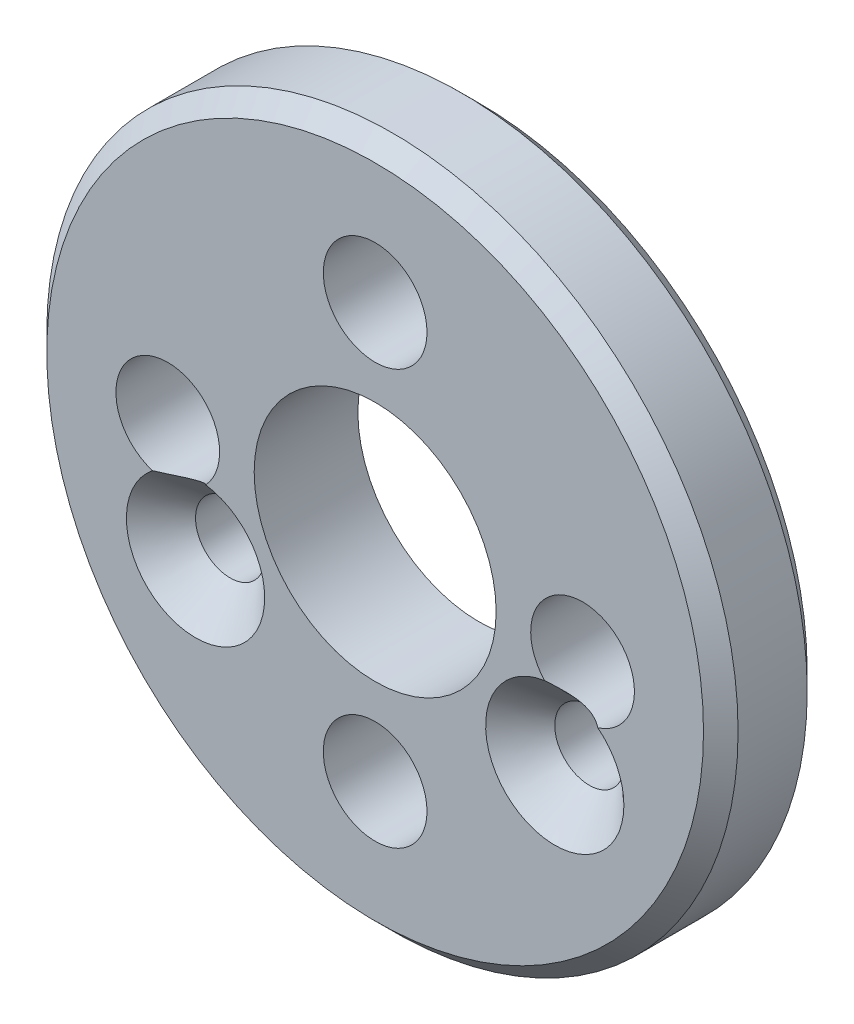
ISO-10303-21;
HEADER;
FILE_DESCRIPTION(('STEP AP214'),'2;1');
FILE_NAME('part.step','',(''),(''),'','','');
FILE_SCHEMA(('AUTOMOTIVE_DESIGN { 1 0 10303 214 1 1 1 1 }'));
ENDSEC;
DATA;
#1=APPLICATION_CONTEXT('core data for automotive mechanical design processes');
#2=APPLICATION_PROTOCOL_DEFINITION('international standard','automotive_design',2000,#1);
#3=PRODUCT_CONTEXT('',#1,'mechanical');
#4=PRODUCT('Part','Part','',(#3));
#5=PRODUCT_RELATED_PRODUCT_CATEGORY('part','',(#4));
#6=PRODUCT_DEFINITION_FORMATION('','',#4);
#7=PRODUCT_DEFINITION_CONTEXT('part definition',#1,'design');
#8=PRODUCT_DEFINITION('design','',#6,#7);
#9=PRODUCT_DEFINITION_SHAPE('','',#8);
#10=(LENGTH_UNIT() NAMED_UNIT(*) SI_UNIT(.MILLI.,.METRE.));
#11=(NAMED_UNIT(*) PLANE_ANGLE_UNIT() SI_UNIT($,.RADIAN.));
#12=(NAMED_UNIT(*) SI_UNIT($,.STERADIAN.) SOLID_ANGLE_UNIT());
#13=UNCERTAINTY_MEASURE_WITH_UNIT(LENGTH_MEASURE(1.E-05),#10,'distance_accuracy_value','');
#14=(GEOMETRIC_REPRESENTATION_CONTEXT(3) GLOBAL_UNCERTAINTY_ASSIGNED_CONTEXT((#13)) GLOBAL_UNIT_ASSIGNED_CONTEXT((#10,
#11,#12)) REPRESENTATION_CONTEXT('',''));
#15=CARTESIAN_POINT('',(0.,0.,0.));
#16=DIRECTION('',(0.,0.,1.));
#17=DIRECTION('',(1.,0.,0.));
#18=AXIS2_PLACEMENT_3D('',#15,#16,#17);
#19=CARTESIAN_POINT('',(-5.1961524227065,-3.00000000000022,3.));
#20=DIRECTION('',(0.,0.,-1.));
#21=DIRECTION('',(-1.,0.,0.));
#22=AXIS2_PLACEMENT_3D('',#19,#20,#21);
#23=CYLINDRICAL_SURFACE('',#22,1.00000000000048);
#24=CARTESIAN_POINT('',(-5.1961524227065,-3.00000000000022,2.));
#25=DIRECTION('',(0.,0.,1.));
#26=DIRECTION('',(1.,0.,0.));
#27=AXIS2_PLACEMENT_3D('',#24,#25,#26);
#28=CIRCLE('',#27,1.00000000000048);
#29=CARTESIAN_POINT('',(-4.19615242270602,-3.00000000000022,2.));
#30=VERTEX_POINT('',#29);
#31=EDGE_CURVE('E58',#30,#30,#28,.T.);
#32=ORIENTED_EDGE('',*,*,#31,.T.);
#33=EDGE_LOOP('',(#32));
#34=FACE_BOUND('',#33,.T.);
#35=CARTESIAN_POINT('',(-5.1961524227065,-3.00000000000022,0.));
#36=DIRECTION('',(0.,0.,1.));
#37=DIRECTION('',(1.,0.,0.));
#38=AXIS2_PLACEMENT_3D('',#35,#36,#37);
#39=CIRCLE('',#38,1.00000000000048);
#40=CARTESIAN_POINT('',(-4.19615242270602,-3.00000000000022,0.));
#41=VERTEX_POINT('',#40);
#42=EDGE_CURVE('E94',#41,#41,#39,.T.);
#43=ORIENTED_EDGE('',*,*,#42,.F.);
#44=EDGE_LOOP('',(#43));
#45=FACE_BOUND('',#44,.T.);
#46=ADVANCED_FACE('F42',(#34,#45),#23,.F.);
#47=CARTESIAN_POINT('',(5.19615242270676,-2.99999999999978,3.));
#48=DIRECTION('',(0.,0.,-1.));
#49=DIRECTION('',(-1.,0.,0.));
#50=AXIS2_PLACEMENT_3D('',#47,#48,#49);
#51=CYLINDRICAL_SURFACE('',#50,1.00000000000033);
#52=CARTESIAN_POINT('',(5.19615242270676,-2.99999999999978,1.99999999999999));
#53=DIRECTION('',(0.,0.,1.));
#54=DIRECTION('',(1.,0.,0.));
#55=AXIS2_PLACEMENT_3D('',#52,#53,#54);
#56=CIRCLE('',#55,1.00000000000033);
#57=CARTESIAN_POINT('',(6.19615242270709,-2.99999999999978,1.99999999999999));
#58=VERTEX_POINT('',#57);
#59=EDGE_CURVE('E88',#58,#58,#56,.T.);
#60=ORIENTED_EDGE('',*,*,#59,.T.);
#61=EDGE_LOOP('',(#60));
#62=FACE_BOUND('',#61,.T.);
#63=CARTESIAN_POINT('',(5.19615242270676,-2.99999999999978,0.));
#64=DIRECTION('',(0.,0.,1.));
#65=DIRECTION('',(1.,0.,0.));
#66=AXIS2_PLACEMENT_3D('',#63,#64,#65);
#67=CIRCLE('',#66,1.00000000000033);
#68=CARTESIAN_POINT('',(6.19615242270709,-2.99999999999978,0.));
#69=VERTEX_POINT('',#68);
#70=EDGE_CURVE('E102',#69,#69,#67,.T.);
#71=ORIENTED_EDGE('',*,*,#70,.F.);
#72=EDGE_LOOP('',(#71));
#73=FACE_BOUND('',#72,.T.);
#74=ADVANCED_FACE('F204',(#62,#73),#51,.F.);
#75=CARTESIAN_POINT('',(0.,6.,3.));
#76=DIRECTION('',(0.,0.,-1.));
#77=DIRECTION('',(-1.,0.,0.));
#78=AXIS2_PLACEMENT_3D('',#75,#76,#77);
#79=CYLINDRICAL_SURFACE('',#78,1.5);
#80=CARTESIAN_POINT('',(0.,6.,3.));
#81=DIRECTION('',(0.,0.,1.));
#82=DIRECTION('',(1.,0.,0.));
#83=AXIS2_PLACEMENT_3D('',#80,#81,#82);
#84=CIRCLE('',#83,1.5);
#85=CARTESIAN_POINT('',(1.5,6.,3.));
#86=VERTEX_POINT('',#85);
#87=EDGE_CURVE('E111',#86,#86,#84,.T.);
#88=ORIENTED_EDGE('',*,*,#87,.T.);
#89=EDGE_LOOP('',(#88));
#90=FACE_BOUND('',#89,.T.);
#91=CARTESIAN_POINT('',(0.,6.,0.));
#92=DIRECTION('',(0.,0.,1.));
#93=DIRECTION('',(1.,0.,0.));
#94=AXIS2_PLACEMENT_3D('',#91,#92,#93);
#95=CIRCLE('',#94,1.5);
#96=CARTESIAN_POINT('',(1.5,6.,0.));
#97=VERTEX_POINT('',#96);
#98=EDGE_CURVE('E132',#97,#97,#95,.T.);
#99=ORIENTED_EDGE('',*,*,#98,.F.);
#100=EDGE_LOOP('',(#99));
#101=FACE_BOUND('',#100,.T.);
#102=ADVANCED_FACE('F211',(#90,#101),#79,.F.);
#103=CARTESIAN_POINT('',(0.,0.,3.));
#104=DIRECTION('',(0.,0.,-1.));
#105=DIRECTION('',(-1.,0.,0.));
#106=AXIS2_PLACEMENT_3D('',#103,#104,#105);
#107=CYLINDRICAL_SURFACE('',#106,3.5);
#108=CARTESIAN_POINT('',(0.,0.,3.));
#109=DIRECTION('',(0.,0.,1.));
#110=DIRECTION('',(1.,0.,0.));
#111=AXIS2_PLACEMENT_3D('',#108,#109,#110);
#112=CIRCLE('',#111,3.5);
#113=CARTESIAN_POINT('',(3.5,0.,3.));
#114=VERTEX_POINT('',#113);
#115=EDGE_CURVE('E107',#114,#114,#112,.T.);
#116=ORIENTED_EDGE('',*,*,#115,.T.);
#117=EDGE_LOOP('',(#116));
#118=FACE_BOUND('',#117,.T.);
#119=CARTESIAN_POINT('',(0.,0.,0.));
#120=DIRECTION('',(0.,0.,1.));
#121=DIRECTION('',(1.,0.,0.));
#122=AXIS2_PLACEMENT_3D('',#119,#120,#121);
#123=CIRCLE('',#122,3.5);
#124=CARTESIAN_POINT('',(3.5,0.,0.));
#125=VERTEX_POINT('',#124);
#126=EDGE_CURVE('E128',#125,#125,#123,.T.);
#127=ORIENTED_EDGE('',*,*,#126,.F.);
#128=EDGE_LOOP('',(#127));
#129=FACE_BOUND('',#128,.T.);
#130=ADVANCED_FACE('F201',(#118,#129),#107,.F.);
#131=CARTESIAN_POINT('',(6.,0.,3.));
#132=DIRECTION('',(0.,0.,-1.));
#133=DIRECTION('',(-1.,0.,0.));
#134=AXIS2_PLACEMENT_3D('',#131,#132,#133);
#135=CYLINDRICAL_SURFACE('',#134,1.5);
#136=CARTESIAN_POINT('',(6.,0.,3.));
#137=DIRECTION('',(0.,0.,1.));
#138=DIRECTION('',(1.,0.,0.));
#139=AXIS2_PLACEMENT_3D('',#136,#137,#138);
#140=CIRCLE('',#139,1.5);
#141=CARTESIAN_POINT('',(6.44015518955278,-1.43396771550472,3.));
#142=VERTEX_POINT('',#141);
#143=CARTESIAN_POINT('',(4.90183056648743,-1.02177487505748,3.));
#144=VERTEX_POINT('',#143);
#145=EDGE_CURVE('E99',#142,#144,#140,.T.);
#146=ORIENTED_EDGE('',*,*,#145,.T.);
#147=CARTESIAN_POINT('',(4.90183056648743,-1.02177487505748,3.));
#148=CARTESIAN_POINT('',(4.92303302315713,-1.04455010634076,2.97436761381311));
#149=CARTESIAN_POINT('',(4.94519274903347,-1.06695677851051,2.94916265504846));
#150=CARTESIAN_POINT('',(4.99169474628061,-1.11101632940224,2.89990143946854));
#151=CARTESIAN_POINT('',(5.01604475565149,-1.13266612784486,2.87584975539361));
#152=CARTESIAN_POINT('',(5.06756966313104,-1.17546443690684,2.82890254432455));
#153=CARTESIAN_POINT('',(5.09479260085054,-1.19659329556961,2.80604125349631));
#154=CARTESIAN_POINT('',(5.15181461390856,-1.23766506118033,2.76267577910277));
#155=CARTESIAN_POINT('',(5.18160958326442,-1.25760977561294,2.74216795608576));
#156=CARTESIAN_POINT('',(5.24732745051386,-1.29812416275665,2.70229131852149));
#157=CARTESIAN_POINT('',(5.28356519774468,-1.31853730159963,2.68327165448615));
#158=CARTESIAN_POINT('',(5.35936861498474,-1.35697600552206,2.65064894130602));
#159=CARTESIAN_POINT('',(5.39891524719251,-1.3750138742689,2.63701718258703));
#160=CARTESIAN_POINT('',(5.48160909505413,-1.4082889179449,2.61651922916684));
#161=CARTESIAN_POINT('',(5.52479921930215,-1.42348301347582,2.60975114662465));
#162=CARTESIAN_POINT('',(5.61288371735046,-1.44991380689649,2.60447285500694));
#163=CARTESIAN_POINT('',(5.65777766724778,-1.46115148206517,2.6059606051268));
#164=CARTESIAN_POINT('',(5.74122031871436,-1.47803776645549,2.61614415623826));
#165=CARTESIAN_POINT('',(5.779791059305,-1.48424309741212,2.62381862404778));
#166=CARTESIAN_POINT('',(5.85596575959592,-1.49356262311997,2.6441824575592));
#167=CARTESIAN_POINT('',(5.89356870202823,-1.49667368511689,2.65687688752916));
#168=CARTESIAN_POINT('',(5.99028855399017,-1.50116608714846,2.69532202107824));
#169=CARTESIAN_POINT('',(6.04821885701077,-1.50026341998393,2.72428024948017));
#170=CARTESIAN_POINT('',(6.15998827339364,-1.49250284567381,2.78868939821998));
#171=CARTESIAN_POINT('',(6.21381054041502,-1.4856217142774,2.82416521281803));
#172=CARTESIAN_POINT('',(6.29615553892666,-1.47079752560843,2.88361392274339));
#173=CARTESIAN_POINT('',(6.32594507991869,-1.46446727544544,2.90628506665992));
#174=CARTESIAN_POINT('',(6.38405411901989,-1.45030565663829,2.95251436417402));
#175=CARTESIAN_POINT('',(6.4123836143051,-1.44248693447057,2.9760637891204));
#176=CARTESIAN_POINT('',(6.44015518955278,-1.43396771550472,3.));
#177=B_SPLINE_CURVE_WITH_KNOTS('',3,(#147,#148,#149,#150,#151,#152,#153,#154,#155,#156,#157,
#158,#159,#160,#161,#162,#163,#164,#165,#166,#167,#168,#169,#170,#171,#172,#173,#174,#175,#176),
.UNSPECIFIED.,.F.,.F.,(4,2,2,2,2,2,2,2,2,2,2,2,2,2,4),(0.,0.120963514809028,0.242372554440347,
0.366294637531073,0.490022426258154,0.626819965138981,0.762878417532659,0.900855438277749,
1.03879835324465,1.15773611838754,1.27679417839394,1.47000198331899,1.66396370614888,
1.77780417133892,1.89071741224536),.UNSPECIFIED.);
#178=EDGE_CURVE('E64',#144,#142,#177,.T.);
#179=ORIENTED_EDGE('',*,*,#178,.T.);
#180=EDGE_LOOP('',(#146,#179));
#181=FACE_BOUND('',#180,.T.);
#182=CARTESIAN_POINT('',(6.,0.,0.));
#183=DIRECTION('',(0.,0.,1.));
#184=DIRECTION('',(1.,0.,0.));
#185=AXIS2_PLACEMENT_3D('',#182,#183,#184);
#186=CIRCLE('',#185,1.5);
#187=CARTESIAN_POINT('',(7.5,0.,0.));
#188=VERTEX_POINT('',#187);
#189=EDGE_CURVE('E124',#188,#188,#186,.T.);
#190=ORIENTED_EDGE('',*,*,#189,.F.);
#191=EDGE_LOOP('',(#190));
#192=FACE_BOUND('',#191,.T.);
#193=ADVANCED_FACE('F165',(#181,#192),#135,.F.);
#194=CARTESIAN_POINT('',(0.,-6.,3.));
#195=DIRECTION('',(0.,0.,-1.));
#196=DIRECTION('',(-1.,0.,0.));
#197=AXIS2_PLACEMENT_3D('',#194,#195,#196);
#198=CYLINDRICAL_SURFACE('',#197,1.5);
#199=CARTESIAN_POINT('',(0.,-6.,3.));
#200=DIRECTION('',(0.,0.,1.));
#201=DIRECTION('',(1.,0.,0.));
#202=AXIS2_PLACEMENT_3D('',#199,#200,#201);
#203=CIRCLE('',#202,1.5);
#204=CARTESIAN_POINT('',(1.49999999999996,-6.,3.));
#205=VERTEX_POINT('',#204);
#206=EDGE_CURVE('E93',#205,#205,#203,.T.);
#207=ORIENTED_EDGE('',*,*,#206,.T.);
#208=EDGE_LOOP('',(#207));
#209=FACE_BOUND('',#208,.T.);
#210=CARTESIAN_POINT('',(0.,-6.,0.));
#211=DIRECTION('',(0.,0.,1.));
#212=DIRECTION('',(1.,0.,0.));
#213=AXIS2_PLACEMENT_3D('',#210,#211,#212);
#214=CIRCLE('',#213,1.5);
#215=CARTESIAN_POINT('',(1.49999999999996,-6.,0.));
#216=VERTEX_POINT('',#215);
#217=EDGE_CURVE('E120',#216,#216,#214,.T.);
#218=ORIENTED_EDGE('',*,*,#217,.F.);
#219=EDGE_LOOP('',(#218));
#220=FACE_BOUND('',#219,.T.);
#221=ADVANCED_FACE('F193',(#209,#220),#198,.F.);
#222=CARTESIAN_POINT('',(-6.,0.,3.));
#223=DIRECTION('',(0.,0.,-1.));
#224=DIRECTION('',(-1.,0.,0.));
#225=AXIS2_PLACEMENT_3D('',#222,#223,#224);
#226=CYLINDRICAL_SURFACE('',#225,1.5);
#227=CARTESIAN_POINT('',(-6.,0.,3.));
#228=DIRECTION('',(0.,0.,1.));
#229=DIRECTION('',(1.,0.,0.));
#230=AXIS2_PLACEMENT_3D('',#227,#228,#229);
#231=CIRCLE('',#230,1.5);
#232=CARTESIAN_POINT('',(-4.90183056648771,-1.0217748750577,3.));
#233=VERTEX_POINT('',#232);
#234=CARTESIAN_POINT('',(-6.44015518955228,-1.43396771550479,3.));
#235=VERTEX_POINT('',#234);
#236=EDGE_CURVE('E85',#233,#235,#231,.T.);
#237=ORIENTED_EDGE('',*,*,#236,.T.);
#238=CARTESIAN_POINT('',(-6.44015518955228,-1.43396771550479,3.));
#239=CARTESIAN_POINT('',(-6.41040570781207,-1.44309041603831,2.97436761381314));
#240=CARTESIAN_POINT('',(-6.38001148617741,-1.45141530041339,2.94916265504852));
#241=CARTESIAN_POINT('',(-6.31770979978885,-1.46632099214137,2.89990143946866));
#242=CARTESIAN_POINT('',(-6.28579717386999,-1.47289526289404,2.87584975539376));
#243=CARTESIAN_POINT('',(-6.21977614053412,-1.48419723204093,2.82890254432476));
#244=CARTESIAN_POINT('',(-6.18563595557204,-1.4888838915361,2.80604125349655));
#245=CARTESIAN_POINT('',(-6.11571756088357,-1.49594207740424,2.76267577910306));
#246=CARTESIAN_POINT('',(-6.07994200330014,-1.49831722209617,2.74216795608608));
#247=CARTESIAN_POINT('',(-6.00277146720775,-1.50054477695665,2.70229131852184));
#248=CARTESIAN_POINT('',(-5.96118208810846,-1.50010420015024,2.6832716544865));
#249=CARTESIAN_POINT('',(-5.87631505112365,-1.49549138561558,2.65064894130638));
#250=CARTESIAN_POINT('',(-5.83304772862418,-1.49133932207657,2.6370171825874));
#251=CARTESIAN_POINT('',(-5.74479523380132,-1.47880943128121,2.61651922916723));
#252=CARTESIAN_POINT('',(-5.69979444124446,-1.47037284187449,2.60975114662505));
#253=CARTESIAN_POINT('',(-5.61029563154468,-1.44922033139481,2.60447285500737));
#254=CARTESIAN_POINT('',(-5.56579749287303,-1.4365054686217,2.60596060512724));
#255=CARTESIAN_POINT('',(-5.48509089474868,-1.40940809414593,2.61614415623872));
#256=CARTESIAN_POINT('',(-5.44858498807609,-1.39549669809794,2.62381862404825));
#257=CARTESIAN_POINT('',(-5.37795599964457,-1.36548029396669,2.64418245755969));
#258=CARTESIAN_POINT('',(-5.34383536524268,-1.34937308147262,2.65687688752965));
#259=CARTESIAN_POINT('',(-5.25782731537759,-1.30490368977497,2.69532202107876));
#260=CARTESIAN_POINT('',(-5.20810953489507,-1.27515680556901,2.7242802494807));
#261=CARTESIAN_POINT('',(-5.11519466809638,-1.21255124287702,2.78868939822055));
#262=CARTESIAN_POINT('',(-5.07202378326479,-1.17968087477025,2.82416521281863));
#263=CARTESIAN_POINT('',(-5.00812301701371,-1.12567025153667,2.88361392274391));
#264=CARTESIAN_POINT('',(-4.98548964282913,-1.10529332358728,2.90628506666034));
#265=CARTESIAN_POINT('',(-4.94224654818175,-1.06397448239116,2.95251436417424));
#266=CARTESIAN_POINT('',(-4.9216218466723,-1.04303852272627,2.97606378912051));
#267=CARTESIAN_POINT('',(-4.90183056648771,-1.0217748750577,3.));
#268=B_SPLINE_CURVE_WITH_KNOTS('',3,(#238,#239,#240,#241,#242,#243,#244,#245,#246,#247,#248,
#249,#250,#251,#252,#253,#254,#255,#256,#257,#258,#259,#260,#261,#262,#263,#264,#265,#266,#267),
.UNSPECIFIED.,.F.,.F.,(4,2,2,2,2,2,2,2,2,2,2,2,2,2,4),(0.,0.120963514808911,0.242372554440114,
0.366294637530719,0.490022426257677,0.626819965138522,0.762878417532214,0.90085543827732,
1.03879835324424,1.15773611838714,1.27679417839354,1.47000198331867,1.66396370614863,
1.77780417133818,1.89071741224413),.UNSPECIFIED.);
#269=EDGE_CURVE('E11',#235,#233,#268,.T.);
#270=ORIENTED_EDGE('',*,*,#269,.T.);
#271=EDGE_LOOP('',(#237,#270));
#272=FACE_BOUND('',#271,.T.);
#273=CARTESIAN_POINT('',(-6.,0.,0.));
#274=DIRECTION('',(0.,0.,1.));
#275=DIRECTION('',(1.,0.,0.));
#276=AXIS2_PLACEMENT_3D('',#273,#274,#275);
#277=CIRCLE('',#276,1.5);
#278=CARTESIAN_POINT('',(-4.5,0.,0.));
#279=VERTEX_POINT('',#278);
#280=EDGE_CURVE('E116',#279,#279,#277,.T.);
#281=ORIENTED_EDGE('',*,*,#280,.F.);
#282=EDGE_LOOP('',(#281));
#283=FACE_BOUND('',#282,.T.);
#284=ADVANCED_FACE('F90',(#272,#283),#226,.F.);
#285=CARTESIAN_POINT('',(0.,0.,3.));
#286=DIRECTION('',(0.,0.,-1.));
#287=DIRECTION('',(-1.,0.,0.));
#288=AXIS2_PLACEMENT_3D('',#285,#286,#287);
#289=CYLINDRICAL_SURFACE('',#288,10.);
#290=CARTESIAN_POINT('',(0.,0.,0.5));
#291=DIRECTION('',(0.,0.,1.));
#292=DIRECTION('',(1.,0.,0.));
#293=AXIS2_PLACEMENT_3D('',#290,#291,#292);
#294=CIRCLE('',#293,10.);
#295=CARTESIAN_POINT('',(10.,0.,0.5));
#296=VERTEX_POINT('',#295);
#297=EDGE_CURVE('E142',#296,#296,#294,.T.);
#298=ORIENTED_EDGE('',*,*,#297,.T.);
#299=EDGE_LOOP('',(#298));
#300=FACE_BOUND('',#299,.T.);
#301=CARTESIAN_POINT('',(0.,0.,2.5));
#302=DIRECTION('',(0.,0.,1.));
#303=DIRECTION('',(1.,0.,0.));
#304=AXIS2_PLACEMENT_3D('',#301,#302,#303);
#305=CIRCLE('',#304,10.);
#306=CARTESIAN_POINT('',(10.,0.,2.5));
#307=VERTEX_POINT('',#306);
#308=EDGE_CURVE('E115',#307,#307,#305,.F.);
#309=ORIENTED_EDGE('',*,*,#308,.T.);
#310=EDGE_LOOP('',(#309));
#311=FACE_BOUND('',#310,.T.);
#312=ADVANCED_FACE('F192',(#300,#311),#289,.T.);
#313=CARTESIAN_POINT('',(0.,0.,3.));
#314=DIRECTION('',(0.,0.,1.));
#315=DIRECTION('',(1.,0.,0.));
#316=AXIS2_PLACEMENT_3D('',#313,#314,#315);
#317=PLANE('',#316);
#318=CARTESIAN_POINT('',(0.,0.,3.));
#319=DIRECTION('',(0.,0.,1.));
#320=DIRECTION('',(1.,0.,0.));
#321=AXIS2_PLACEMENT_3D('',#318,#319,#320);
#322=CIRCLE('',#321,9.50000000000001);
#323=CARTESIAN_POINT('',(9.50000000000001,0.,3.));
#324=VERTEX_POINT('',#323);
#325=EDGE_CURVE('E150',#324,#324,#322,.T.);
#326=ORIENTED_EDGE('',*,*,#325,.T.);
#327=EDGE_LOOP('',(#326));
#328=FACE_BOUND('',#327,.T.);
#329=ORIENTED_EDGE('',*,*,#236,.F.);
#330=CARTESIAN_POINT('',(-5.1961524227065,-3.00000000000022,3.));
#331=DIRECTION('',(0.,0.,1.));
#332=DIRECTION('',(1.,0.,0.));
#333=AXIS2_PLACEMENT_3D('',#330,#331,#332);
#334=CIRCLE('',#333,2.00000000000049);
#335=EDGE_CURVE('E78',#233,#235,#334,.F.);
#336=ORIENTED_EDGE('',*,*,#335,.T.);
#337=EDGE_LOOP('',(#329,#336));
#338=FACE_BOUND('',#337,.T.);
#339=ORIENTED_EDGE('',*,*,#206,.F.);
#340=EDGE_LOOP('',(#339));
#341=FACE_BOUND('',#340,.T.);
#342=ORIENTED_EDGE('',*,*,#145,.F.);
#343=CARTESIAN_POINT('',(5.19615242270676,-2.99999999999978,3.));
#344=DIRECTION('',(0.,0.,1.));
#345=DIRECTION('',(1.,0.,0.));
#346=AXIS2_PLACEMENT_3D('',#343,#344,#345);
#347=CIRCLE('',#346,2.00000000000034);
#348=EDGE_CURVE('E87',#142,#144,#347,.F.);
#349=ORIENTED_EDGE('',*,*,#348,.T.);
#350=EDGE_LOOP('',(#342,#349));
#351=FACE_BOUND('',#350,.T.);
#352=ORIENTED_EDGE('',*,*,#115,.F.);
#353=EDGE_LOOP('',(#352));
#354=FACE_BOUND('',#353,.T.);
#355=ORIENTED_EDGE('',*,*,#87,.F.);
#356=EDGE_LOOP('',(#355));
#357=FACE_BOUND('',#356,.T.);
#358=ADVANCED_FACE('F83',(#328,#338,#341,#351,#354,#357),#317,.T.);
#359=CARTESIAN_POINT('',(0.,0.,0.));
#360=DIRECTION('',(0.,0.,1.));
#361=DIRECTION('',(1.,0.,0.));
#362=AXIS2_PLACEMENT_3D('',#359,#360,#361);
#363=PLANE('',#362);
#364=CARTESIAN_POINT('',(0.,0.,0.));
#365=DIRECTION('',(0.,0.,1.));
#366=DIRECTION('',(1.,0.,0.));
#367=AXIS2_PLACEMENT_3D('',#364,#365,#366);
#368=CIRCLE('',#367,9.5);
#369=CARTESIAN_POINT('',(9.5,0.,0.));
#370=VERTEX_POINT('',#369);
#371=EDGE_CURVE('E146',#370,#370,#368,.F.);
#372=ORIENTED_EDGE('',*,*,#371,.T.);
#373=EDGE_LOOP('',(#372));
#374=FACE_BOUND('',#373,.T.);
#375=ORIENTED_EDGE('',*,*,#280,.T.);
#376=EDGE_LOOP('',(#375));
#377=FACE_BOUND('',#376,.T.);
#378=ORIENTED_EDGE('',*,*,#217,.T.);
#379=EDGE_LOOP('',(#378));
#380=FACE_BOUND('',#379,.T.);
#381=ORIENTED_EDGE('',*,*,#189,.T.);
#382=EDGE_LOOP('',(#381));
#383=FACE_BOUND('',#382,.T.);
#384=ORIENTED_EDGE('',*,*,#126,.T.);
#385=EDGE_LOOP('',(#384));
#386=FACE_BOUND('',#385,.T.);
#387=ORIENTED_EDGE('',*,*,#98,.T.);
#388=EDGE_LOOP('',(#387));
#389=FACE_BOUND('',#388,.T.);
#390=ORIENTED_EDGE('',*,*,#70,.T.);
#391=EDGE_LOOP('',(#390));
#392=FACE_BOUND('',#391,.T.);
#393=ORIENTED_EDGE('',*,*,#42,.T.);
#394=EDGE_LOOP('',(#393));
#395=FACE_BOUND('',#394,.T.);
#396=ADVANCED_FACE('F188',(#374,#377,#380,#383,#386,#389,#392,#395),#363,.F.);
#397=CARTESIAN_POINT('',(0.,0.,0.5));
#398=DIRECTION('',(0.,0.,1.));
#399=DIRECTION('',(1.,0.,0.));
#400=AXIS2_PLACEMENT_3D('',#397,#398,#399);
#401=CONICAL_SURFACE('',#400,10.,0.78539816339745);
#402=ORIENTED_EDGE('',*,*,#371,.F.);
#403=EDGE_LOOP('',(#402));
#404=FACE_BOUND('',#403,.T.);
#405=ORIENTED_EDGE('',*,*,#297,.F.);
#406=EDGE_LOOP('',(#405));
#407=FACE_BOUND('',#406,.T.);
#408=ADVANCED_FACE('F183',(#404,#407),#401,.T.);
#409=CARTESIAN_POINT('',(0.,0.,3.));
#410=DIRECTION('',(0.,0.,-1.));
#411=DIRECTION('',(-1.,0.,0.));
#412=AXIS2_PLACEMENT_3D('',#409,#410,#411);
#413=CONICAL_SURFACE('',#412,9.50000000000001,0.785398163397445);
#414=ORIENTED_EDGE('',*,*,#308,.F.);
#415=EDGE_LOOP('',(#414));
#416=FACE_BOUND('',#415,.T.);
#417=ORIENTED_EDGE('',*,*,#325,.F.);
#418=EDGE_LOOP('',(#417));
#419=FACE_BOUND('',#418,.T.);
#420=ADVANCED_FACE('F177',(#416,#419),#413,.T.);
#421=CARTESIAN_POINT('',(5.19615242270676,-2.99999999999978,1.99999999999999));
#422=DIRECTION('',(0.,0.,1.));
#423=DIRECTION('',(1.,0.,0.));
#424=AXIS2_PLACEMENT_3D('',#421,#422,#423);
#425=CONICAL_SURFACE('',#424,1.00000000000033,0.78539816339745);
#426=ORIENTED_EDGE('',*,*,#178,.F.);
#427=ORIENTED_EDGE('',*,*,#348,.F.);
#428=EDGE_LOOP('',(#426,#427));
#429=FACE_BOUND('',#428,.T.);
#430=ORIENTED_EDGE('',*,*,#59,.F.);
#431=EDGE_LOOP('',(#430));
#432=FACE_BOUND('',#431,.T.);
#433=ADVANCED_FACE('F170',(#429,#432),#425,.F.);
#434=CARTESIAN_POINT('',(-5.1961524227065,-3.00000000000022,2.));
#435=DIRECTION('',(0.,0.,1.));
#436=DIRECTION('',(1.,0.,0.));
#437=AXIS2_PLACEMENT_3D('',#434,#435,#436);
#438=CONICAL_SURFACE('',#437,1.00000000000048,0.78539816339745);
#439=ORIENTED_EDGE('',*,*,#269,.F.);
#440=ORIENTED_EDGE('',*,*,#335,.F.);
#441=EDGE_LOOP('',(#439,#440));
#442=FACE_BOUND('',#441,.T.);
#443=ORIENTED_EDGE('',*,*,#31,.F.);
#444=EDGE_LOOP('',(#443));
#445=FACE_BOUND('',#444,.T.);
#446=ADVANCED_FACE('F45',(#442,#445),#438,.F.);
#447=CLOSED_SHELL('',(#46,#74,#102,#130,#193,#221,#284,#312,#358,#396,#408,#420,#433,#446));
#448=MANIFOLD_SOLID_BREP('B2',#447);
#449=ADVANCED_BREP_SHAPE_REPRESENTATION('',(#18,#448),#14);
#450=SHAPE_DEFINITION_REPRESENTATION(#9,#449);
ENDSEC;
END-ISO-10303-21;
